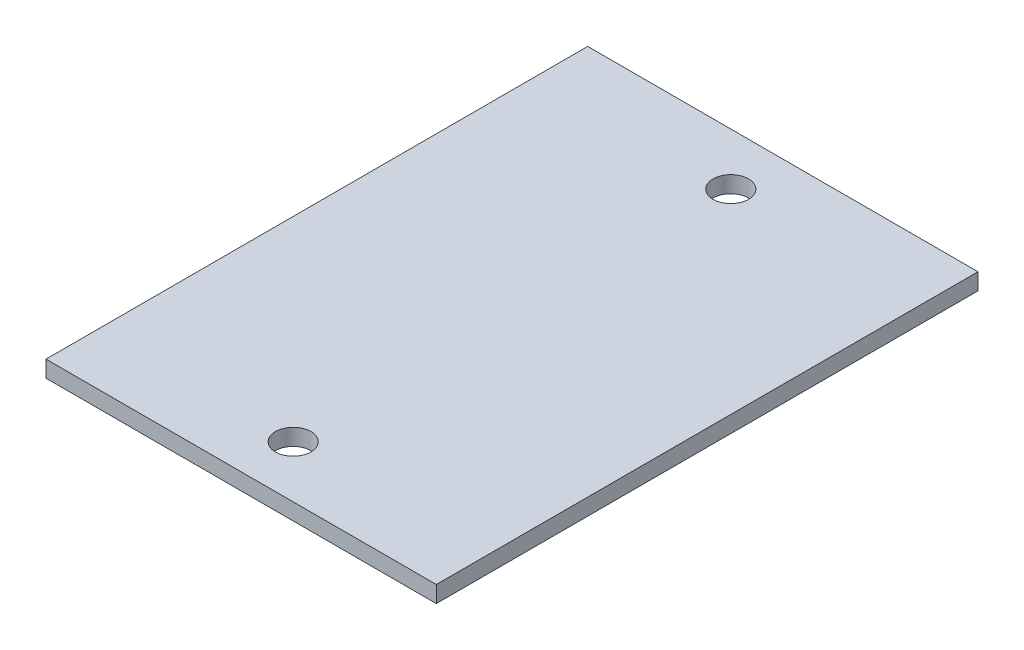
ISO-10303-21;
HEADER;
FILE_DESCRIPTION(('STEP AP214'),'2;1');
FILE_NAME('part.step','',(''),(''),'','','');
FILE_SCHEMA(('AUTOMOTIVE_DESIGN { 1 0 10303 214 1 1 1 1 }'));
ENDSEC;
DATA;
#1=APPLICATION_CONTEXT('core data for automotive mechanical design processes');
#2=APPLICATION_PROTOCOL_DEFINITION('international standard','automotive_design',2000,#1);
#3=PRODUCT_CONTEXT('',#1,'mechanical');
#4=PRODUCT('Part','Part','',(#3));
#5=PRODUCT_RELATED_PRODUCT_CATEGORY('part','',(#4));
#6=PRODUCT_DEFINITION_FORMATION('','',#4);
#7=PRODUCT_DEFINITION_CONTEXT('part definition',#1,'design');
#8=PRODUCT_DEFINITION('design','',#6,#7);
#9=PRODUCT_DEFINITION_SHAPE('','',#8);
#10=(LENGTH_UNIT() NAMED_UNIT(*) SI_UNIT(.MILLI.,.METRE.));
#11=(NAMED_UNIT(*) PLANE_ANGLE_UNIT() SI_UNIT($,.RADIAN.));
#12=(NAMED_UNIT(*) SI_UNIT($,.STERADIAN.) SOLID_ANGLE_UNIT());
#13=UNCERTAINTY_MEASURE_WITH_UNIT(LENGTH_MEASURE(1.E-05),#10,'distance_accuracy_value','');
#14=(GEOMETRIC_REPRESENTATION_CONTEXT(3) GLOBAL_UNCERTAINTY_ASSIGNED_CONTEXT((#13)) GLOBAL_UNIT_ASSIGNED_CONTEXT((#10,
#11,#12)) REPRESENTATION_CONTEXT('',''));
#15=CARTESIAN_POINT('',(0.,0.,0.));
#16=DIRECTION('',(0.,0.,1.));
#17=DIRECTION('',(1.,0.,0.));
#18=AXIS2_PLACEMENT_3D('',#15,#16,#17);
#19=CARTESIAN_POINT('',(0.,1.4,0.));
#20=DIRECTION('',(0.,-1.,0.));
#21=DIRECTION('',(0.,0.,-1.));
#22=AXIS2_PLACEMENT_3D('',#19,#20,#21);
#23=PLANE('',#22);
#24=DIRECTION('',(0.,0.,-1.));
#25=VECTOR('',#24,1.);
#26=CARTESIAN_POINT('',(16.5,1.4,22.9));
#27=LINE('',#26,#25);
#28=CARTESIAN_POINT('',(16.5,1.4,22.9));
#29=VERTEX_POINT('',#28);
#30=CARTESIAN_POINT('',(16.5,1.4,-22.9));
#31=VERTEX_POINT('',#30);
#32=EDGE_CURVE('E89',#29,#31,#27,.T.);
#33=ORIENTED_EDGE('',*,*,#32,.T.);
#34=DIRECTION('',(-1.,0.,0.));
#35=VECTOR('',#34,1.);
#36=CARTESIAN_POINT('',(-16.5,1.4,-22.9));
#37=LINE('',#36,#35);
#38=CARTESIAN_POINT('',(-16.5,1.4,-22.9));
#39=VERTEX_POINT('',#38);
#40=EDGE_CURVE('E84',#31,#39,#37,.T.);
#41=ORIENTED_EDGE('',*,*,#40,.T.);
#42=DIRECTION('',(0.,0.,1.));
#43=VECTOR('',#42,1.);
#44=CARTESIAN_POINT('',(-16.5,1.4,22.9));
#45=LINE('',#44,#43);
#46=CARTESIAN_POINT('',(-16.5,1.4,22.9));
#47=VERTEX_POINT('',#46);
#48=EDGE_CURVE('E87',#39,#47,#45,.T.);
#49=ORIENTED_EDGE('',*,*,#48,.T.);
#50=DIRECTION('',(1.,0.,0.));
#51=VECTOR('',#50,1.);
#52=CARTESIAN_POINT('',(-16.5,1.4,22.9));
#53=LINE('',#52,#51);
#54=EDGE_CURVE('E54',#47,#29,#53,.T.);
#55=ORIENTED_EDGE('',*,*,#54,.T.);
#56=EDGE_LOOP('',(#33,#41,#49,#55));
#57=FACE_BOUND('',#56,.T.);
#58=CARTESIAN_POINT('',(0.,1.4,-18.5));
#59=DIRECTION('',(0.,1.,0.));
#60=DIRECTION('',(0.,0.,1.));
#61=AXIS2_PLACEMENT_3D('',#58,#59,#60);
#62=CIRCLE('',#61,1.5);
#63=CARTESIAN_POINT('',(0.,1.4,-17.));
#64=VERTEX_POINT('',#63);
#65=EDGE_CURVE('E104',#64,#64,#62,.T.);
#66=ORIENTED_EDGE('',*,*,#65,.F.);
#67=EDGE_LOOP('',(#66));
#68=FACE_BOUND('',#67,.T.);
#69=CARTESIAN_POINT('',(0.,1.4,18.5));
#70=DIRECTION('',(0.,1.,0.));
#71=DIRECTION('',(0.,0.,1.));
#72=AXIS2_PLACEMENT_3D('',#69,#70,#71);
#73=CIRCLE('',#72,1.5);
#74=CARTESIAN_POINT('',(0.,1.4,20.));
#75=VERTEX_POINT('',#74);
#76=EDGE_CURVE('E119',#75,#75,#73,.T.);
#77=ORIENTED_EDGE('',*,*,#76,.F.);
#78=EDGE_LOOP('',(#77));
#79=FACE_BOUND('',#78,.T.);
#80=ADVANCED_FACE('F37',(#57,#68,#79),#23,.F.);
#81=CARTESIAN_POINT('',(0.,0.,0.));
#82=DIRECTION('',(0.,-1.,0.));
#83=DIRECTION('',(0.,0.,-1.));
#84=AXIS2_PLACEMENT_3D('',#81,#82,#83);
#85=PLANE('',#84);
#86=CARTESIAN_POINT('',(0.,0.,-18.5));
#87=DIRECTION('',(0.,1.,0.));
#88=DIRECTION('',(0.,0.,1.));
#89=AXIS2_PLACEMENT_3D('',#86,#87,#88);
#90=CIRCLE('',#89,1.5);
#91=CARTESIAN_POINT('',(0.,0.,-17.));
#92=VERTEX_POINT('',#91);
#93=EDGE_CURVE('E116',#92,#92,#90,.T.);
#94=ORIENTED_EDGE('',*,*,#93,.T.);
#95=EDGE_LOOP('',(#94));
#96=FACE_BOUND('',#95,.T.);
#97=DIRECTION('',(0.,0.,-1.));
#98=VECTOR('',#97,1.);
#99=CARTESIAN_POINT('',(16.5,0.,22.9));
#100=LINE('',#99,#98);
#101=CARTESIAN_POINT('',(16.5,0.,22.9));
#102=VERTEX_POINT('',#101);
#103=CARTESIAN_POINT('',(16.5,0.,-22.9));
#104=VERTEX_POINT('',#103);
#105=EDGE_CURVE('E101',#102,#104,#100,.T.);
#106=ORIENTED_EDGE('',*,*,#105,.F.);
#107=DIRECTION('',(1.,0.,0.));
#108=VECTOR('',#107,1.);
#109=CARTESIAN_POINT('',(-16.5,0.,22.9));
#110=LINE('',#109,#108);
#111=CARTESIAN_POINT('',(-16.5,0.,22.9));
#112=VERTEX_POINT('',#111);
#113=EDGE_CURVE('E77',#112,#102,#110,.T.);
#114=ORIENTED_EDGE('',*,*,#113,.F.);
#115=DIRECTION('',(0.,0.,1.));
#116=VECTOR('',#115,1.);
#117=CARTESIAN_POINT('',(-16.5,0.,22.9));
#118=LINE('',#117,#116);
#119=CARTESIAN_POINT('',(-16.5,0.,-22.9));
#120=VERTEX_POINT('',#119);
#121=EDGE_CURVE('E71',#120,#112,#118,.T.);
#122=ORIENTED_EDGE('',*,*,#121,.F.);
#123=DIRECTION('',(-1.,0.,0.));
#124=VECTOR('',#123,1.);
#125=CARTESIAN_POINT('',(-16.5,0.,-22.9));
#126=LINE('',#125,#124);
#127=EDGE_CURVE('E93',#104,#120,#126,.T.);
#128=ORIENTED_EDGE('',*,*,#127,.F.);
#129=EDGE_LOOP('',(#106,#114,#122,#128));
#130=FACE_BOUND('',#129,.T.);
#131=CARTESIAN_POINT('',(0.,0.,18.5));
#132=DIRECTION('',(0.,1.,0.));
#133=DIRECTION('',(0.,0.,1.));
#134=AXIS2_PLACEMENT_3D('',#131,#132,#133);
#135=CIRCLE('',#134,1.5);
#136=CARTESIAN_POINT('',(0.,0.,20.));
#137=VERTEX_POINT('',#136);
#138=EDGE_CURVE('E122',#137,#137,#135,.T.);
#139=ORIENTED_EDGE('',*,*,#138,.T.);
#140=EDGE_LOOP('',(#139));
#141=FACE_BOUND('',#140,.T.);
#142=ADVANCED_FACE('F112',(#96,#130,#141),#85,.T.);
#143=CARTESIAN_POINT('',(16.5,1.4,22.9));
#144=DIRECTION('',(-1.,0.,0.));
#145=DIRECTION('',(0.,0.,1.));
#146=AXIS2_PLACEMENT_3D('',#143,#144,#145);
#147=PLANE('',#146);
#148=ORIENTED_EDGE('',*,*,#105,.T.);
#149=DIRECTION('',(0.,-1.,0.));
#150=VECTOR('',#149,1.);
#151=CARTESIAN_POINT('',(16.5,1.4,-22.9));
#152=LINE('',#151,#150);
#153=EDGE_CURVE('E11',#31,#104,#152,.T.);
#154=ORIENTED_EDGE('',*,*,#153,.F.);
#155=ORIENTED_EDGE('',*,*,#32,.F.);
#156=DIRECTION('',(0.,-1.,0.));
#157=VECTOR('',#156,1.);
#158=CARTESIAN_POINT('',(16.5,1.4,22.9));
#159=LINE('',#158,#157);
#160=EDGE_CURVE('E97',#29,#102,#159,.T.);
#161=ORIENTED_EDGE('',*,*,#160,.T.);
#162=EDGE_LOOP('',(#148,#154,#155,#161));
#163=FACE_BOUND('',#162,.T.);
#164=ADVANCED_FACE('F39',(#163),#147,.F.);
#165=CARTESIAN_POINT('',(-16.5,1.4,-22.9));
#166=DIRECTION('',(0.,0.,1.));
#167=DIRECTION('',(1.,0.,0.));
#168=AXIS2_PLACEMENT_3D('',#165,#166,#167);
#169=PLANE('',#168);
#170=ORIENTED_EDGE('',*,*,#127,.T.);
#171=DIRECTION('',(0.,-1.,0.));
#172=VECTOR('',#171,1.);
#173=CARTESIAN_POINT('',(-16.5,1.4,-22.9));
#174=LINE('',#173,#172);
#175=EDGE_CURVE('E46',#39,#120,#174,.T.);
#176=ORIENTED_EDGE('',*,*,#175,.F.);
#177=ORIENTED_EDGE('',*,*,#40,.F.);
#178=ORIENTED_EDGE('',*,*,#153,.T.);
#179=EDGE_LOOP('',(#170,#176,#177,#178));
#180=FACE_BOUND('',#179,.T.);
#181=ADVANCED_FACE('F92',(#180),#169,.F.);
#182=CARTESIAN_POINT('',(-16.5,1.4,22.9));
#183=DIRECTION('',(1.,0.,0.));
#184=DIRECTION('',(0.,0.,-1.));
#185=AXIS2_PLACEMENT_3D('',#182,#183,#184);
#186=PLANE('',#185);
#187=ORIENTED_EDGE('',*,*,#121,.T.);
#188=DIRECTION('',(0.,-1.,0.));
#189=VECTOR('',#188,1.);
#190=CARTESIAN_POINT('',(-16.5,1.4,22.9));
#191=LINE('',#190,#189);
#192=EDGE_CURVE('E94',#47,#112,#191,.T.);
#193=ORIENTED_EDGE('',*,*,#192,.F.);
#194=ORIENTED_EDGE('',*,*,#48,.F.);
#195=ORIENTED_EDGE('',*,*,#175,.T.);
#196=EDGE_LOOP('',(#187,#193,#194,#195));
#197=FACE_BOUND('',#196,.T.);
#198=ADVANCED_FACE('F95',(#197),#186,.F.);
#199=CARTESIAN_POINT('',(-16.5,1.4,22.9));
#200=DIRECTION('',(0.,0.,-1.));
#201=DIRECTION('',(-1.,0.,0.));
#202=AXIS2_PLACEMENT_3D('',#199,#200,#201);
#203=PLANE('',#202);
#204=ORIENTED_EDGE('',*,*,#113,.T.);
#205=ORIENTED_EDGE('',*,*,#160,.F.);
#206=ORIENTED_EDGE('',*,*,#54,.F.);
#207=ORIENTED_EDGE('',*,*,#192,.T.);
#208=EDGE_LOOP('',(#204,#205,#206,#207));
#209=FACE_BOUND('',#208,.T.);
#210=ADVANCED_FACE('F109',(#209),#203,.F.);
#211=CARTESIAN_POINT('',(0.,1.4,-18.5));
#212=DIRECTION('',(0.,-1.,0.));
#213=DIRECTION('',(0.,0.,-1.));
#214=AXIS2_PLACEMENT_3D('',#211,#212,#213);
#215=CYLINDRICAL_SURFACE('',#214,1.5);
#216=ORIENTED_EDGE('',*,*,#65,.T.);
#217=EDGE_LOOP('',(#216));
#218=FACE_BOUND('',#217,.T.);
#219=ORIENTED_EDGE('',*,*,#93,.F.);
#220=EDGE_LOOP('',(#219));
#221=FACE_BOUND('',#220,.T.);
#222=ADVANCED_FACE('F139',(#218,#221),#215,.F.);
#223=CARTESIAN_POINT('',(0.,1.4,18.5));
#224=DIRECTION('',(0.,-1.,0.));
#225=DIRECTION('',(0.,0.,-1.));
#226=AXIS2_PLACEMENT_3D('',#223,#224,#225);
#227=CYLINDRICAL_SURFACE('',#226,1.5);
#228=ORIENTED_EDGE('',*,*,#76,.T.);
#229=EDGE_LOOP('',(#228));
#230=FACE_BOUND('',#229,.T.);
#231=ORIENTED_EDGE('',*,*,#138,.F.);
#232=EDGE_LOOP('',(#231));
#233=FACE_BOUND('',#232,.T.);
#234=ADVANCED_FACE('F128',(#230,#233),#227,.F.);
#235=CLOSED_SHELL('',(#80,#142,#164,#181,#198,#210,#222,#234));
#236=MANIFOLD_SOLID_BREP('B2',#235);
#237=ADVANCED_BREP_SHAPE_REPRESENTATION('',(#18,#236),#14);
#238=SHAPE_DEFINITION_REPRESENTATION(#9,#237);
ENDSEC;
END-ISO-10303-21;
